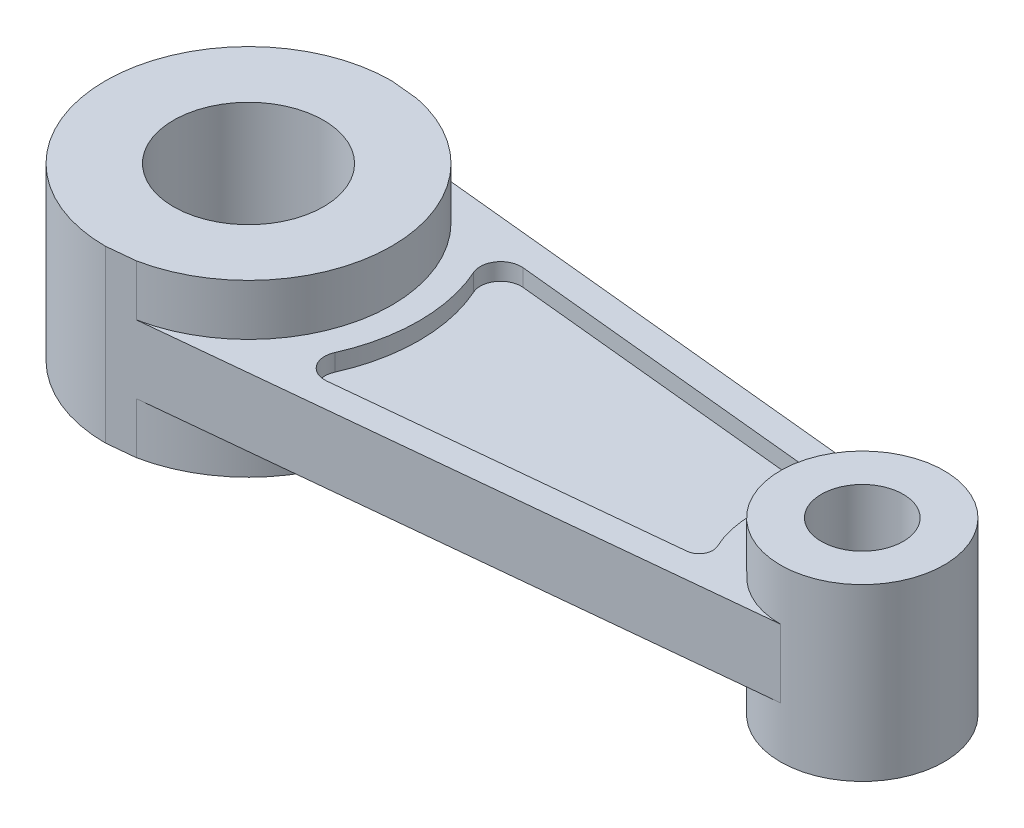
ISO-10303-21;
HEADER;
FILE_DESCRIPTION(('STEP AP214'),'2;1');
FILE_NAME('part.step','',(''),(''),'','','');
FILE_SCHEMA(('AUTOMOTIVE_DESIGN { 1 0 10303 214 1 1 1 1 }'));
ENDSEC;
DATA;
#1=APPLICATION_CONTEXT('core data for automotive mechanical design processes');
#2=APPLICATION_PROTOCOL_DEFINITION('international standard','automotive_design',2000,#1);
#3=PRODUCT_CONTEXT('',#1,'mechanical');
#4=PRODUCT('Part','Part','',(#3));
#5=PRODUCT_RELATED_PRODUCT_CATEGORY('part','',(#4));
#6=PRODUCT_DEFINITION_FORMATION('','',#4);
#7=PRODUCT_DEFINITION_CONTEXT('part definition',#1,'design');
#8=PRODUCT_DEFINITION('design','',#6,#7);
#9=PRODUCT_DEFINITION_SHAPE('','',#8);
#10=(LENGTH_UNIT() NAMED_UNIT(*) SI_UNIT(.MILLI.,.METRE.));
#11=(NAMED_UNIT(*) PLANE_ANGLE_UNIT() SI_UNIT($,.RADIAN.));
#12=(NAMED_UNIT(*) SI_UNIT($,.STERADIAN.) SOLID_ANGLE_UNIT());
#13=UNCERTAINTY_MEASURE_WITH_UNIT(LENGTH_MEASURE(1.E-05),#10,'distance_accuracy_value','');
#14=(GEOMETRIC_REPRESENTATION_CONTEXT(3) GLOBAL_UNCERTAINTY_ASSIGNED_CONTEXT((#13)) GLOBAL_UNIT_ASSIGNED_CONTEXT((#10,
#11,#12)) REPRESENTATION_CONTEXT('',''));
#15=CARTESIAN_POINT('',(0.,0.,0.));
#16=DIRECTION('',(0.,0.,1.));
#17=DIRECTION('',(1.,0.,0.));
#18=AXIS2_PLACEMENT_3D('',#15,#16,#17);
#19=CARTESIAN_POINT('',(1.34984303085783,5.,-13.4984303085783));
#20=DIRECTION('',(0.0995037190209988,0.,-0.995037190209989));
#21=DIRECTION('',(-0.995037190209989,0.,-0.0995037190209988));
#22=AXIS2_PLACEMENT_3D('',#19,#20,#21);
#23=PLANE('',#22);
#24=DIRECTION('',(0.995037190209989,0.,0.0995037190209988));
#25=VECTOR('',#24,1.);
#26=CARTESIAN_POINT('',(-7.59721293666229,2.5,-14.3931359053303));
#27=LINE('',#26,#25);
#28=CARTESIAN_POINT('',(-7.59721293666229,2.5,-14.3931359053303));
#29=VERTEX_POINT('',#28);
#30=CARTESIAN_POINT('',(40.4165773665371,2.5,-9.59175687501041));
#31=VERTEX_POINT('',#30);
#32=EDGE_CURVE('E545',#29,#31,#27,.T.);
#33=ORIENTED_EDGE('',*,*,#32,.T.);
#34=DIRECTION('',(0.,-1.,0.));
#35=VECTOR('',#34,1.);
#36=CARTESIAN_POINT('',(40.4165773665371,5.,-9.59175687501041));
#37=LINE('',#36,#35);
#38=CARTESIAN_POINT('',(40.4165773665371,5.,-9.59175687501041));
#39=VERTEX_POINT('',#38);
#40=EDGE_CURVE('E245',#39,#31,#37,.T.);
#41=ORIENTED_EDGE('',*,*,#40,.F.);
#42=DIRECTION('',(0.995037190209989,0.,0.0995037190209988));
#43=VECTOR('',#42,1.);
#44=CARTESIAN_POINT('',(1.34984303085783,5.,-13.4984303085783));
#45=LINE('',#44,#43);
#46=CARTESIAN_POINT('',(-7.59721293666229,5.,-14.3931359053303));
#47=VERTEX_POINT('',#46);
#48=EDGE_CURVE('E326',#47,#39,#45,.T.);
#49=ORIENTED_EDGE('',*,*,#48,.F.);
#50=DIRECTION('',(0.,-1.,0.));
#51=VECTOR('',#50,1.);
#52=CARTESIAN_POINT('',(-7.59721293666229,5.,-14.3931359053303));
#53=LINE('',#52,#51);
#54=EDGE_CURVE('E382',#47,#29,#53,.T.);
#55=ORIENTED_EDGE('',*,*,#54,.T.);
#56=EDGE_LOOP('',(#33,#41,#49,#55));
#57=FACE_BOUND('',#56,.T.);
#58=ADVANCED_FACE('F39',(#57),#23,.F.);
#59=CARTESIAN_POINT('',(40.2175699284951,5.,-7.60168249459042));
#60=DIRECTION('',(0.,-1.,0.));
#61=DIRECTION('',(0.,0.,-1.));
#62=AXIS2_PLACEMENT_3D('',#59,#60,#61);
#63=CYLINDRICAL_SURFACE('',#62,2.);
#64=CARTESIAN_POINT('',(40.2175699284951,2.5,-7.60168249459042));
#65=DIRECTION('',(0.,-1.,0.));
#66=DIRECTION('',(0.,0.,-1.));
#67=AXIS2_PLACEMENT_3D('',#64,#65,#66);
#68=CIRCLE('',#67,2.);
#69=CARTESIAN_POINT('',(42.0304675587873,2.5,-6.7570511063026));
#70=VERTEX_POINT('',#69);
#71=EDGE_CURVE('E537',#31,#70,#68,.T.);
#72=ORIENTED_EDGE('',*,*,#71,.T.);
#73=DIRECTION('',(0.,-1.,0.));
#74=VECTOR('',#73,1.);
#75=CARTESIAN_POINT('',(42.0304675587873,5.,-6.7570511063026));
#76=LINE('',#75,#74);
#77=CARTESIAN_POINT('',(42.0304675587873,5.,-6.7570511063026));
#78=VERTEX_POINT('',#77);
#79=EDGE_CURVE('E241',#78,#70,#76,.T.);
#80=ORIENTED_EDGE('',*,*,#79,.F.);
#81=CARTESIAN_POINT('',(40.2175699284951,5.,-7.60168249459042));
#82=DIRECTION('',(0.,1.,0.));
#83=DIRECTION('',(0.,0.,1.));
#84=AXIS2_PLACEMENT_3D('',#81,#82,#83);
#85=CIRCLE('',#84,2.);
#86=EDGE_CURVE('E334',#39,#78,#85,.F.);
#87=ORIENTED_EDGE('',*,*,#86,.F.);
#88=ORIENTED_EDGE('',*,*,#40,.T.);
#89=EDGE_LOOP('',(#72,#80,#87,#88));
#90=FACE_BOUND('',#89,.T.);
#91=ADVANCED_FACE('F467',(#90),#63,.F.);
#92=CARTESIAN_POINT('',(56.5336486011247,5.,0.));
#93=DIRECTION('',(0.,-1.,0.));
#94=DIRECTION('',(0.,0.,-1.));
#95=AXIS2_PLACEMENT_3D('',#92,#93,#94);
#96=CYLINDRICAL_SURFACE('',#95,16.);
#97=CARTESIAN_POINT('',(56.5336486011247,2.5,0.));
#98=DIRECTION('',(0.,1.,0.));
#99=DIRECTION('',(0.,0.,1.));
#100=AXIS2_PLACEMENT_3D('',#97,#98,#99);
#101=CIRCLE('',#100,16.);
#102=CARTESIAN_POINT('',(42.0304675587873,2.5,6.75705110630259));
#103=VERTEX_POINT('',#102);
#104=EDGE_CURVE('E532',#70,#103,#101,.T.);
#105=ORIENTED_EDGE('',*,*,#104,.T.);
#106=DIRECTION('',(0.,-1.,0.));
#107=VECTOR('',#106,1.);
#108=CARTESIAN_POINT('',(42.0304675587873,5.,6.7570511063026));
#109=LINE('',#108,#107);
#110=CARTESIAN_POINT('',(42.0304675587873,5.,6.7570511063026));
#111=VERTEX_POINT('',#110);
#112=EDGE_CURVE('E237',#111,#103,#109,.T.);
#113=ORIENTED_EDGE('',*,*,#112,.F.);
#114=CARTESIAN_POINT('',(56.5336486011247,5.,0.));
#115=DIRECTION('',(0.,1.,0.));
#116=DIRECTION('',(0.,0.,1.));
#117=AXIS2_PLACEMENT_3D('',#114,#115,#116);
#118=CIRCLE('',#117,16.);
#119=EDGE_CURVE('E336',#78,#111,#118,.T.);
#120=ORIENTED_EDGE('',*,*,#119,.F.);
#121=ORIENTED_EDGE('',*,*,#79,.T.);
#122=EDGE_LOOP('',(#105,#113,#120,#121));
#123=FACE_BOUND('',#122,.T.);
#124=ADVANCED_FACE('F472',(#123),#96,.T.);
#125=CARTESIAN_POINT('',(40.2175699284951,5.,7.60168249459043));
#126=DIRECTION('',(0.,-1.,0.));
#127=DIRECTION('',(0.,0.,-1.));
#128=AXIS2_PLACEMENT_3D('',#125,#126,#127);
#129=CYLINDRICAL_SURFACE('',#128,2.);
#130=ORIENTED_EDGE('',*,*,#112,.T.);
#131=CARTESIAN_POINT('',(40.2175699284951,2.5,7.60168249459043));
#132=DIRECTION('',(0.,1.,0.));
#133=DIRECTION('',(0.,0.,1.));
#134=AXIS2_PLACEMENT_3D('',#131,#132,#133);
#135=CIRCLE('',#134,2.);
#136=CARTESIAN_POINT('',(40.4165773665371,2.5,9.5917568750104));
#137=VERTEX_POINT('',#136);
#138=EDGE_CURVE('E536',#137,#103,#135,.T.);
#139=ORIENTED_EDGE('',*,*,#138,.F.);
#140=DIRECTION('',(0.,-1.,0.));
#141=VECTOR('',#140,1.);
#142=CARTESIAN_POINT('',(40.4165773665371,5.,9.59175687501041));
#143=LINE('',#142,#141);
#144=CARTESIAN_POINT('',(40.4165773665371,5.,9.59175687501041));
#145=VERTEX_POINT('',#144);
#146=EDGE_CURVE('E233',#145,#137,#143,.T.);
#147=ORIENTED_EDGE('',*,*,#146,.F.);
#148=CARTESIAN_POINT('',(40.2175699284951,5.,7.60168249459043));
#149=DIRECTION('',(0.,1.,0.));
#150=DIRECTION('',(0.,0.,1.));
#151=AXIS2_PLACEMENT_3D('',#148,#149,#150);
#152=CIRCLE('',#151,2.);
#153=EDGE_CURVE('E338',#145,#111,#152,.T.);
#154=ORIENTED_EDGE('',*,*,#153,.T.);
#155=EDGE_LOOP('',(#130,#139,#147,#154));
#156=FACE_BOUND('',#155,.T.);
#157=ADVANCED_FACE('F520',(#156),#129,.F.);
#158=CARTESIAN_POINT('',(1.34984303085783,5.,13.4984303085783));
#159=DIRECTION('',(-0.0995037190209988,0.,-0.995037190209989));
#160=DIRECTION('',(-0.995037190209989,0.,0.0995037190209988));
#161=AXIS2_PLACEMENT_3D('',#158,#159,#160);
#162=PLANE('',#161);
#163=ORIENTED_EDGE('',*,*,#146,.T.);
#164=DIRECTION('',(0.995037190209989,0.,-0.0995037190209988));
#165=VECTOR('',#164,1.);
#166=CARTESIAN_POINT('',(-7.59721293666228,2.5,14.3931359053303));
#167=LINE('',#166,#165);
#168=CARTESIAN_POINT('',(-7.59721293666228,2.5,14.3931359053303));
#169=VERTEX_POINT('',#168);
#170=EDGE_CURVE('E445',#169,#137,#167,.T.);
#171=ORIENTED_EDGE('',*,*,#170,.F.);
#172=DIRECTION('',(0.,-1.,0.));
#173=VECTOR('',#172,1.);
#174=CARTESIAN_POINT('',(-7.59721293666228,5.,14.3931359053303));
#175=LINE('',#174,#173);
#176=CARTESIAN_POINT('',(-7.59721293666228,5.,14.3931359053303));
#177=VERTEX_POINT('',#176);
#178=EDGE_CURVE('E219',#177,#169,#175,.T.);
#179=ORIENTED_EDGE('',*,*,#178,.F.);
#180=DIRECTION('',(0.995037190209989,0.,-0.0995037190209988));
#181=VECTOR('',#180,1.);
#182=CARTESIAN_POINT('',(1.34984303085783,5.,13.4984303085783));
#183=LINE('',#182,#181);
#184=EDGE_CURVE('E341',#177,#145,#183,.T.);
#185=ORIENTED_EDGE('',*,*,#184,.T.);
#186=EDGE_LOOP('',(#163,#171,#179,#185));
#187=FACE_BOUND('',#186,.T.);
#188=ADVANCED_FACE('F517',(#187),#162,.T.);
#189=CARTESIAN_POINT('',(-7.89572409372528,5.,11.4080243347004));
#190=DIRECTION('',(0.,-1.,0.));
#191=DIRECTION('',(0.,0.,-1.));
#192=AXIS2_PLACEMENT_3D('',#189,#190,#191);
#193=CYLINDRICAL_SURFACE('',#192,3.);
#194=CARTESIAN_POINT('',(-7.89572409372528,2.5,11.4080243347004));
#195=DIRECTION('',(0.,-1.,0.));
#196=DIRECTION('',(0.,0.,-1.));
#197=AXIS2_PLACEMENT_3D('',#194,#195,#196);
#198=CIRCLE('',#197,3.);
#199=CARTESIAN_POINT('',(-10.6354341621342,2.5,10.1857360131253));
#200=VERTEX_POINT('',#199);
#201=EDGE_CURVE('E203',#169,#200,#198,.T.);
#202=ORIENTED_EDGE('',*,*,#201,.T.);
#203=DIRECTION('',(0.,-1.,0.));
#204=VECTOR('',#203,1.);
#205=CARTESIAN_POINT('',(-10.6354341621342,5.,10.1857360131253));
#206=LINE('',#205,#204);
#207=CARTESIAN_POINT('',(-10.6354341621342,5.,10.1857360131253));
#208=VERTEX_POINT('',#207);
#209=EDGE_CURVE('E217',#208,#200,#206,.T.);
#210=ORIENTED_EDGE('',*,*,#209,.F.);
#211=CARTESIAN_POINT('',(-7.89572409372528,5.,11.4080243347004));
#212=DIRECTION('',(0.,1.,0.));
#213=DIRECTION('',(0.,0.,1.));
#214=AXIS2_PLACEMENT_3D('',#211,#212,#213);
#215=CIRCLE('',#214,3.);
#216=EDGE_CURVE('E344',#177,#208,#215,.F.);
#217=ORIENTED_EDGE('',*,*,#216,.F.);
#218=ORIENTED_EDGE('',*,*,#178,.T.);
#219=EDGE_LOOP('',(#202,#210,#217,#218));
#220=FACE_BOUND('',#219,.T.);
#221=ADVANCED_FACE('F215',(#220),#193,.F.);
#222=CARTESIAN_POINT('',(-33.4663513988753,5.,0.));
#223=DIRECTION('',(0.,-1.,0.));
#224=DIRECTION('',(0.,0.,-1.));
#225=AXIS2_PLACEMENT_3D('',#222,#223,#224);
#226=CYLINDRICAL_SURFACE('',#225,25.);
#227=CARTESIAN_POINT('',(-33.4663513988753,2.5,0.));
#228=DIRECTION('',(0.,1.,0.));
#229=DIRECTION('',(0.,0.,1.));
#230=AXIS2_PLACEMENT_3D('',#227,#228,#229);
#231=CIRCLE('',#230,25.);
#232=CARTESIAN_POINT('',(-10.6354341621342,2.5,-10.1857360131253));
#233=VERTEX_POINT('',#232);
#234=EDGE_CURVE('E200',#200,#233,#231,.T.);
#235=ORIENTED_EDGE('',*,*,#234,.T.);
#236=DIRECTION('',(0.,-1.,0.));
#237=VECTOR('',#236,1.);
#238=CARTESIAN_POINT('',(-10.6354341621342,5.,-10.1857360131253));
#239=LINE('',#238,#237);
#240=CARTESIAN_POINT('',(-10.6354341621342,5.,-10.1857360131253));
#241=VERTEX_POINT('',#240);
#242=EDGE_CURVE('E228',#241,#233,#239,.T.);
#243=ORIENTED_EDGE('',*,*,#242,.F.);
#244=CARTESIAN_POINT('',(-33.4663513988753,5.,0.));
#245=DIRECTION('',(0.,1.,0.));
#246=DIRECTION('',(0.,0.,1.));
#247=AXIS2_PLACEMENT_3D('',#244,#245,#246);
#248=CIRCLE('',#247,25.);
#249=EDGE_CURVE('E223',#208,#241,#248,.T.);
#250=ORIENTED_EDGE('',*,*,#249,.F.);
#251=ORIENTED_EDGE('',*,*,#209,.T.);
#252=EDGE_LOOP('',(#235,#243,#250,#251));
#253=FACE_BOUND('',#252,.T.);
#254=ADVANCED_FACE('F222',(#253),#226,.T.);
#255=CARTESIAN_POINT('',(-7.89572409372528,5.,-11.4080243347004));
#256=DIRECTION('',(0.,-1.,0.));
#257=DIRECTION('',(0.,0.,-1.));
#258=AXIS2_PLACEMENT_3D('',#255,#256,#257);
#259=CYLINDRICAL_SURFACE('',#258,3.);
#260=ORIENTED_EDGE('',*,*,#242,.T.);
#261=CARTESIAN_POINT('',(-7.89572409372528,2.5,-11.4080243347004));
#262=DIRECTION('',(0.,1.,0.));
#263=DIRECTION('',(0.,0.,1.));
#264=AXIS2_PLACEMENT_3D('',#261,#262,#263);
#265=CIRCLE('',#264,3.);
#266=EDGE_CURVE('E206',#29,#233,#265,.T.);
#267=ORIENTED_EDGE('',*,*,#266,.F.);
#268=ORIENTED_EDGE('',*,*,#54,.F.);
#269=CARTESIAN_POINT('',(-7.89572409372528,5.,-11.4080243347004));
#270=DIRECTION('',(0.,1.,0.));
#271=DIRECTION('',(0.,0.,1.));
#272=AXIS2_PLACEMENT_3D('',#269,#270,#271);
#273=CIRCLE('',#272,3.);
#274=EDGE_CURVE('E252',#47,#241,#273,.T.);
#275=ORIENTED_EDGE('',*,*,#274,.T.);
#276=EDGE_LOOP('',(#260,#267,#268,#275));
#277=FACE_BOUND('',#276,.T.);
#278=ADVANCED_FACE('F496',(#277),#259,.F.);
#279=CARTESIAN_POINT('',(-33.4663513988753,12.5,0.));
#280=DIRECTION('',(0.,-1.,0.));
#281=DIRECTION('',(0.,0.,-1.));
#282=AXIS2_PLACEMENT_3D('',#279,#280,#281);
#283=CYLINDRICAL_SURFACE('',#282,21.);
#284=CARTESIAN_POINT('',(-33.4663513988753,-5.,0.));
#285=DIRECTION('',(0.,1.,0.));
#286=DIRECTION('',(0.,0.,1.));
#287=AXIS2_PLACEMENT_3D('',#284,#285,#286);
#288=CIRCLE('',#287,21.);
#289=CARTESIAN_POINT('',(-29.3079355572912,-5.,20.5841584158416));
#290=VERTEX_POINT('',#289);
#291=CARTESIAN_POINT('',(-29.3079355572912,-5.,-20.5841584158416));
#292=VERTEX_POINT('',#291);
#293=EDGE_CURVE('E354',#290,#292,#288,.T.);
#294=ORIENTED_EDGE('',*,*,#293,.F.);
#295=DIRECTION('',(0.,-1.,0.));
#296=VECTOR('',#295,1.);
#297=CARTESIAN_POINT('',(-29.3079355572912,12.5,20.5841584158416));
#298=LINE('',#297,#296);
#299=CARTESIAN_POINT('',(-29.3079355572912,-12.5,20.5841584158416));
#300=VERTEX_POINT('',#299);
#301=EDGE_CURVE('E47',#290,#300,#298,.T.);
#302=ORIENTED_EDGE('',*,*,#301,.T.);
#303=CARTESIAN_POINT('',(-33.4663513988753,-12.5,0.));
#304=DIRECTION('',(0.,1.,0.));
#305=DIRECTION('',(0.,0.,1.));
#306=AXIS2_PLACEMENT_3D('',#303,#304,#305);
#307=CIRCLE('',#306,21.);
#308=CARTESIAN_POINT('',(-29.3079355572912,-12.5,-20.5841584158416));
#309=VERTEX_POINT('',#308);
#310=EDGE_CURVE('E274',#300,#309,#307,.T.);
#311=ORIENTED_EDGE('',*,*,#310,.T.);
#312=DIRECTION('',(0.,-1.,0.));
#313=VECTOR('',#312,1.);
#314=CARTESIAN_POINT('',(-29.3079355572912,12.5,-20.5841584158416));
#315=LINE('',#314,#313);
#316=EDGE_CURVE('E284',#292,#309,#315,.T.);
#317=ORIENTED_EDGE('',*,*,#316,.F.);
#318=EDGE_LOOP('',(#294,#302,#311,#317));
#319=FACE_BOUND('',#318,.T.);
#320=ADVANCED_FACE('F299',(#319),#283,.T.);
#321=CARTESIAN_POINT('',(1.74785790694183,12.5,17.4785790694183));
#322=DIRECTION('',(-0.0995037190209989,0.,-0.995037190209989));
#323=DIRECTION('',(-0.995037190209989,0.,0.0995037190209989));
#324=AXIS2_PLACEMENT_3D('',#321,#322,#323);
#325=PLANE('',#324);
#326=DIRECTION('',(0.995037190209989,0.,-0.0995037190209989));
#327=VECTOR('',#326,1.);
#328=CARTESIAN_POINT('',(1.74785790694183,-12.5,17.4785790694183));
#329=LINE('',#328,#327);
#330=CARTESIAN_POINT('',(-33.4663513988753,-12.5,21.));
#331=VERTEX_POINT('',#330);
#332=EDGE_CURVE('E271',#331,#300,#329,.T.);
#333=ORIENTED_EDGE('',*,*,#332,.T.);
#334=ORIENTED_EDGE('',*,*,#301,.F.);
#335=DIRECTION('',(0.995037190209989,0.,-0.0995037190209989));
#336=VECTOR('',#335,1.);
#337=CARTESIAN_POINT('',(1.74785790694183,-5.,17.4785790694183));
#338=LINE('',#337,#336);
#339=CARTESIAN_POINT('',(56.5336486011247,-5.,12.));
#340=VERTEX_POINT('',#339);
#341=EDGE_CURVE('E356',#290,#340,#338,.T.);
#342=ORIENTED_EDGE('',*,*,#341,.T.);
#343=DIRECTION('',(0.,-1.,0.));
#344=VECTOR('',#343,1.);
#345=CARTESIAN_POINT('',(56.5336486011247,5.,12.));
#346=LINE('',#345,#344);
#347=CARTESIAN_POINT('',(56.5336486011248,5.,12.));
#348=VERTEX_POINT('',#347);
#349=EDGE_CURVE('E249',#348,#340,#346,.T.);
#350=ORIENTED_EDGE('',*,*,#349,.F.);
#351=DIRECTION('',(0.995037190209989,0.,-0.0995037190209989));
#352=VECTOR('',#351,1.);
#353=CARTESIAN_POINT('',(1.74785790694183,5.,17.4785790694183));
#354=LINE('',#353,#352);
#355=CARTESIAN_POINT('',(-29.3079355572912,5.,20.5841584158416));
#356=VERTEX_POINT('',#355);
#357=EDGE_CURVE('E323',#356,#348,#354,.T.);
#358=ORIENTED_EDGE('',*,*,#357,.F.);
#359=CARTESIAN_POINT('',(-29.3079355572912,12.5,20.5841584158416));
#360=VERTEX_POINT('',#359);
#361=EDGE_CURVE('E11',#360,#356,#298,.T.);
#362=ORIENTED_EDGE('',*,*,#361,.F.);
#363=DIRECTION('',(0.995037190209989,0.,-0.0995037190209989));
#364=VECTOR('',#363,1.);
#365=CARTESIAN_POINT('',(1.74785790694183,12.5,17.4785790694183));
#366=LINE('',#365,#364);
#367=CARTESIAN_POINT('',(-33.4663513988753,12.5,21.));
#368=VERTEX_POINT('',#367);
#369=EDGE_CURVE('E259',#368,#360,#366,.T.);
#370=ORIENTED_EDGE('',*,*,#369,.F.);
#371=DIRECTION('',(0.,-1.,0.));
#372=VECTOR('',#371,1.);
#373=CARTESIAN_POINT('',(-33.4663513988753,12.5,21.));
#374=LINE('',#373,#372);
#375=EDGE_CURVE('E280',#368,#331,#374,.T.);
#376=ORIENTED_EDGE('',*,*,#375,.T.);
#377=EDGE_LOOP('',(#333,#334,#342,#350,#358,#362,#370,#376));
#378=FACE_BOUND('',#377,.T.);
#379=ADVANCED_FACE('F311',(#378),#325,.F.);
#380=ORIENTED_EDGE('',*,*,#361,.T.);
#381=CARTESIAN_POINT('',(-33.4663513988753,5.,0.));
#382=DIRECTION('',(0.,1.,0.));
#383=DIRECTION('',(0.,0.,1.));
#384=AXIS2_PLACEMENT_3D('',#381,#382,#383);
#385=CIRCLE('',#384,21.);
#386=CARTESIAN_POINT('',(-29.3079355572912,5.,-20.5841584158416));
#387=VERTEX_POINT('',#386);
#388=EDGE_CURVE('E320',#356,#387,#385,.T.);
#389=ORIENTED_EDGE('',*,*,#388,.T.);
#390=CARTESIAN_POINT('',(-29.3079355572912,12.5,-20.5841584158416));
#391=VERTEX_POINT('',#390);
#392=EDGE_CURVE('E285',#391,#387,#315,.T.);
#393=ORIENTED_EDGE('',*,*,#392,.F.);
#394=CARTESIAN_POINT('',(-33.4663513988753,12.5,0.));
#395=DIRECTION('',(0.,1.,0.));
#396=DIRECTION('',(0.,0.,1.));
#397=AXIS2_PLACEMENT_3D('',#394,#395,#396);
#398=CIRCLE('',#397,21.);
#399=EDGE_CURVE('E263',#360,#391,#398,.T.);
#400=ORIENTED_EDGE('',*,*,#399,.F.);
#401=EDGE_LOOP('',(#380,#389,#393,#400));
#402=FACE_BOUND('',#401,.T.);
#403=ADVANCED_FACE('F318',(#402),#283,.T.);
#404=CARTESIAN_POINT('',(1.74785790694183,12.5,-17.4785790694183));
#405=DIRECTION('',(0.0995037190209989,0.,-0.995037190209989));
#406=DIRECTION('',(-0.995037190209989,0.,-0.0995037190209989));
#407=AXIS2_PLACEMENT_3D('',#404,#405,#406);
#408=PLANE('',#407);
#409=DIRECTION('',(0.995037190209989,0.,0.0995037190209989));
#410=VECTOR('',#409,1.);
#411=CARTESIAN_POINT('',(1.74785790694183,-12.5,-17.4785790694183));
#412=LINE('',#411,#410);
#413=CARTESIAN_POINT('',(-33.4663513988753,-12.5,-21.));
#414=VERTEX_POINT('',#413);
#415=EDGE_CURVE('E277',#414,#309,#412,.T.);
#416=ORIENTED_EDGE('',*,*,#415,.F.);
#417=DIRECTION('',(0.,-1.,0.));
#418=VECTOR('',#417,1.);
#419=CARTESIAN_POINT('',(-33.4663513988753,12.5,-21.));
#420=LINE('',#419,#418);
#421=CARTESIAN_POINT('',(-33.4663513988753,12.5,-21.));
#422=VERTEX_POINT('',#421);
#423=EDGE_CURVE('E283',#422,#414,#420,.T.);
#424=ORIENTED_EDGE('',*,*,#423,.F.);
#425=DIRECTION('',(0.995037190209989,0.,0.0995037190209989));
#426=VECTOR('',#425,1.);
#427=CARTESIAN_POINT('',(1.74785790694183,12.5,-17.4785790694183));
#428=LINE('',#427,#426);
#429=EDGE_CURVE('E265',#422,#391,#428,.T.);
#430=ORIENTED_EDGE('',*,*,#429,.T.);
#431=ORIENTED_EDGE('',*,*,#392,.T.);
#432=DIRECTION('',(0.995037190209989,0.,0.0995037190209989));
#433=VECTOR('',#432,1.);
#434=CARTESIAN_POINT('',(1.74785790694183,5.,-17.4785790694183));
#435=LINE('',#434,#433);
#436=CARTESIAN_POINT('',(56.5336486011248,5.,-12.));
#437=VERTEX_POINT('',#436);
#438=EDGE_CURVE('E324',#387,#437,#435,.T.);
#439=ORIENTED_EDGE('',*,*,#438,.T.);
#440=DIRECTION('',(0.,-1.,0.));
#441=VECTOR('',#440,1.);
#442=CARTESIAN_POINT('',(56.5336486011247,5.,-12.));
#443=LINE('',#442,#441);
#444=CARTESIAN_POINT('',(56.5336486011247,-5.,-12.));
#445=VERTEX_POINT('',#444);
#446=EDGE_CURVE('E251',#437,#445,#443,.T.);
#447=ORIENTED_EDGE('',*,*,#446,.T.);
#448=DIRECTION('',(0.995037190209989,0.,0.0995037190209989));
#449=VECTOR('',#448,1.);
#450=CARTESIAN_POINT('',(1.74785790694183,-5.,-17.4785790694183));
#451=LINE('',#450,#449);
#452=EDGE_CURVE('E295',#292,#445,#451,.T.);
#453=ORIENTED_EDGE('',*,*,#452,.F.);
#454=ORIENTED_EDGE('',*,*,#316,.T.);
#455=EDGE_LOOP('',(#416,#424,#430,#431,#439,#447,#453,#454));
#456=FACE_BOUND('',#455,.T.);
#457=ADVANCED_FACE('F293',(#456),#408,.T.);
#458=CARTESIAN_POINT('',(-33.4663513988753,12.5,0.));
#459=DIRECTION('',(0.,-1.,0.));
#460=DIRECTION('',(0.,0.,-1.));
#461=AXIS2_PLACEMENT_3D('',#458,#459,#460);
#462=CYLINDRICAL_SURFACE('',#461,11.);
#463=CARTESIAN_POINT('',(-33.4663513988753,12.5,0.));
#464=DIRECTION('',(0.,1.,0.));
#465=DIRECTION('',(0.,0.,1.));
#466=AXIS2_PLACEMENT_3D('',#463,#464,#465);
#467=CIRCLE('',#466,11.);
#468=CARTESIAN_POINT('',(-33.4663513988753,12.5,11.));
#469=VERTEX_POINT('',#468);
#470=EDGE_CURVE('E256',#469,#469,#467,.T.);
#471=ORIENTED_EDGE('',*,*,#470,.T.);
#472=EDGE_LOOP('',(#471));
#473=FACE_BOUND('',#472,.T.);
#474=CARTESIAN_POINT('',(-33.4663513988753,-12.5,0.));
#475=DIRECTION('',(0.,1.,0.));
#476=DIRECTION('',(0.,0.,1.));
#477=AXIS2_PLACEMENT_3D('',#474,#475,#476);
#478=CIRCLE('',#477,11.);
#479=CARTESIAN_POINT('',(-33.4663513988753,-12.5,11.));
#480=VERTEX_POINT('',#479);
#481=EDGE_CURVE('E248',#480,#480,#478,.T.);
#482=ORIENTED_EDGE('',*,*,#481,.F.);
#483=EDGE_LOOP('',(#482));
#484=FACE_BOUND('',#483,.T.);
#485=ADVANCED_FACE('F41',(#473,#484),#462,.F.);
#486=EDGE_CURVE('E260',#414,#331,#307,.T.);
#487=ORIENTED_EDGE('',*,*,#486,.T.);
#488=ORIENTED_EDGE('',*,*,#375,.F.);
#489=EDGE_CURVE('E266',#422,#368,#398,.T.);
#490=ORIENTED_EDGE('',*,*,#489,.F.);
#491=ORIENTED_EDGE('',*,*,#423,.T.);
#492=EDGE_LOOP('',(#487,#488,#490,#491));
#493=FACE_BOUND('',#492,.T.);
#494=ADVANCED_FACE('F307',(#493),#283,.T.);
#495=CARTESIAN_POINT('',(0.,12.5,0.));
#496=DIRECTION('',(0.,1.,0.));
#497=DIRECTION('',(0.,0.,1.));
#498=AXIS2_PLACEMENT_3D('',#495,#496,#497);
#499=PLANE('',#498);
#500=ORIENTED_EDGE('',*,*,#470,.F.);
#501=EDGE_LOOP('',(#500));
#502=FACE_BOUND('',#501,.T.);
#503=ORIENTED_EDGE('',*,*,#369,.T.);
#504=ORIENTED_EDGE('',*,*,#399,.T.);
#505=ORIENTED_EDGE('',*,*,#429,.F.);
#506=ORIENTED_EDGE('',*,*,#489,.T.);
#507=EDGE_LOOP('',(#503,#504,#505,#506));
#508=FACE_BOUND('',#507,.T.);
#509=ADVANCED_FACE('F314',(#502,#508),#499,.T.);
#510=CARTESIAN_POINT('',(0.,-12.5,0.));
#511=DIRECTION('',(0.,1.,0.));
#512=DIRECTION('',(0.,0.,1.));
#513=AXIS2_PLACEMENT_3D('',#510,#511,#512);
#514=PLANE('',#513);
#515=ORIENTED_EDGE('',*,*,#481,.T.);
#516=EDGE_LOOP('',(#515));
#517=FACE_BOUND('',#516,.T.);
#518=ORIENTED_EDGE('',*,*,#332,.F.);
#519=ORIENTED_EDGE('',*,*,#486,.F.);
#520=ORIENTED_EDGE('',*,*,#415,.T.);
#521=ORIENTED_EDGE('',*,*,#310,.F.);
#522=EDGE_LOOP('',(#518,#519,#520,#521));
#523=FACE_BOUND('',#522,.T.);
#524=ADVANCED_FACE('F304',(#517,#523),#514,.F.);
#525=CARTESIAN_POINT('',(40.4165773665371,-2.5,-9.59175687501041));
#526=VERTEX_POINT('',#525);
#527=CARTESIAN_POINT('',(40.4165773665371,-5.,-9.59175687501041));
#528=VERTEX_POINT('',#527);
#529=EDGE_CURVE('E244',#526,#528,#37,.T.);
#530=ORIENTED_EDGE('',*,*,#529,.F.);
#531=DIRECTION('',(0.995037190209989,0.,0.0995037190209988));
#532=VECTOR('',#531,1.);
#533=CARTESIAN_POINT('',(-7.59721293666229,-2.5,-14.3931359053303));
#534=LINE('',#533,#532);
#535=CARTESIAN_POINT('',(-7.59721293666229,-2.5,-14.3931359053303));
#536=VERTEX_POINT('',#535);
#537=EDGE_CURVE('E393',#536,#526,#534,.T.);
#538=ORIENTED_EDGE('',*,*,#537,.F.);
#539=CARTESIAN_POINT('',(-7.59721293666229,-5.,-14.3931359053303));
#540=VERTEX_POINT('',#539);
#541=EDGE_CURVE('E255',#536,#540,#53,.T.);
#542=ORIENTED_EDGE('',*,*,#541,.T.);
#543=DIRECTION('',(0.995037190209989,0.,0.0995037190209988));
#544=VECTOR('',#543,1.);
#545=CARTESIAN_POINT('',(1.34984303085783,-5.,-13.4984303085783));
#546=LINE('',#545,#544);
#547=EDGE_CURVE('E359',#540,#528,#546,.T.);
#548=ORIENTED_EDGE('',*,*,#547,.T.);
#549=EDGE_LOOP('',(#530,#538,#542,#548));
#550=FACE_BOUND('',#549,.T.);
#551=ADVANCED_FACE('F391',(#550),#23,.F.);
#552=CARTESIAN_POINT('',(42.0304675587873,-2.5,-6.7570511063026));
#553=VERTEX_POINT('',#552);
#554=CARTESIAN_POINT('',(42.0304675587873,-5.,-6.7570511063026));
#555=VERTEX_POINT('',#554);
#556=EDGE_CURVE('E240',#553,#555,#76,.T.);
#557=ORIENTED_EDGE('',*,*,#556,.F.);
#558=CARTESIAN_POINT('',(40.2175699284951,-2.5,-7.60168249459042));
#559=DIRECTION('',(0.,-1.,0.));
#560=DIRECTION('',(0.,0.,-1.));
#561=AXIS2_PLACEMENT_3D('',#558,#559,#560);
#562=CIRCLE('',#561,2.);
#563=EDGE_CURVE('E54',#526,#553,#562,.T.);
#564=ORIENTED_EDGE('',*,*,#563,.F.);
#565=ORIENTED_EDGE('',*,*,#529,.T.);
#566=CARTESIAN_POINT('',(40.2175699284951,-5.,-7.60168249459042));
#567=DIRECTION('',(0.,1.,0.));
#568=DIRECTION('',(0.,0.,1.));
#569=AXIS2_PLACEMENT_3D('',#566,#567,#568);
#570=CIRCLE('',#569,2.);
#571=EDGE_CURVE('E362',#528,#555,#570,.F.);
#572=ORIENTED_EDGE('',*,*,#571,.T.);
#573=EDGE_LOOP('',(#557,#564,#565,#572));
#574=FACE_BOUND('',#573,.T.);
#575=ADVANCED_FACE('F422',(#574),#63,.F.);
#576=CARTESIAN_POINT('',(42.0304675587873,-2.5,6.7570511063026));
#577=VERTEX_POINT('',#576);
#578=CARTESIAN_POINT('',(42.0304675587873,-5.,6.7570511063026));
#579=VERTEX_POINT('',#578);
#580=EDGE_CURVE('E236',#577,#579,#109,.T.);
#581=ORIENTED_EDGE('',*,*,#580,.F.);
#582=CARTESIAN_POINT('',(56.5336486011247,-2.5,0.));
#583=DIRECTION('',(0.,1.,0.));
#584=DIRECTION('',(0.,0.,1.));
#585=AXIS2_PLACEMENT_3D('',#582,#583,#584);
#586=CIRCLE('',#585,16.);
#587=EDGE_CURVE('E62',#553,#577,#586,.T.);
#588=ORIENTED_EDGE('',*,*,#587,.F.);
#589=ORIENTED_EDGE('',*,*,#556,.T.);
#590=CARTESIAN_POINT('',(56.5336486011247,-5.,0.));
#591=DIRECTION('',(0.,1.,0.));
#592=DIRECTION('',(0.,0.,1.));
#593=AXIS2_PLACEMENT_3D('',#590,#591,#592);
#594=CIRCLE('',#593,16.);
#595=EDGE_CURVE('E365',#555,#579,#594,.T.);
#596=ORIENTED_EDGE('',*,*,#595,.T.);
#597=EDGE_LOOP('',(#581,#588,#589,#596));
#598=FACE_BOUND('',#597,.T.);
#599=ADVANCED_FACE('F421',(#598),#96,.T.);
#600=CARTESIAN_POINT('',(40.2175699284951,-2.5,7.60168249459043));
#601=DIRECTION('',(0.,1.,0.));
#602=DIRECTION('',(0.,0.,1.));
#603=AXIS2_PLACEMENT_3D('',#600,#601,#602);
#604=CIRCLE('',#603,2.);
#605=CARTESIAN_POINT('',(40.4165773665371,-2.5,9.59175687501041));
#606=VERTEX_POINT('',#605);
#607=EDGE_CURVE('E433',#606,#577,#604,.T.);
#608=ORIENTED_EDGE('',*,*,#607,.T.);
#609=ORIENTED_EDGE('',*,*,#580,.T.);
#610=CARTESIAN_POINT('',(40.2175699284951,-5.,7.60168249459043));
#611=DIRECTION('',(0.,1.,0.));
#612=DIRECTION('',(0.,0.,1.));
#613=AXIS2_PLACEMENT_3D('',#610,#611,#612);
#614=CIRCLE('',#613,2.);
#615=CARTESIAN_POINT('',(40.4165773665371,-5.,9.59175687501041));
#616=VERTEX_POINT('',#615);
#617=EDGE_CURVE('E368',#616,#579,#614,.T.);
#618=ORIENTED_EDGE('',*,*,#617,.F.);
#619=EDGE_CURVE('E232',#606,#616,#143,.T.);
#620=ORIENTED_EDGE('',*,*,#619,.F.);
#621=EDGE_LOOP('',(#608,#609,#618,#620));
#622=FACE_BOUND('',#621,.T.);
#623=ADVANCED_FACE('F420',(#622),#129,.F.);
#624=DIRECTION('',(0.995037190209989,0.,-0.0995037190209988));
#625=VECTOR('',#624,1.);
#626=CARTESIAN_POINT('',(-7.59721293666228,-2.5,14.3931359053303));
#627=LINE('',#626,#625);
#628=CARTESIAN_POINT('',(-7.59721293666228,-2.5,14.3931359053303));
#629=VERTEX_POINT('',#628);
#630=EDGE_CURVE('E220',#629,#606,#627,.T.);
#631=ORIENTED_EDGE('',*,*,#630,.T.);
#632=ORIENTED_EDGE('',*,*,#619,.T.);
#633=DIRECTION('',(0.995037190209989,0.,-0.0995037190209988));
#634=VECTOR('',#633,1.);
#635=CARTESIAN_POINT('',(1.34984303085783,-5.,13.4984303085783));
#636=LINE('',#635,#634);
#637=CARTESIAN_POINT('',(-7.59721293666228,-5.,14.3931359053303));
#638=VERTEX_POINT('',#637);
#639=EDGE_CURVE('E371',#638,#616,#636,.T.);
#640=ORIENTED_EDGE('',*,*,#639,.F.);
#641=EDGE_CURVE('E224',#629,#638,#175,.T.);
#642=ORIENTED_EDGE('',*,*,#641,.F.);
#643=EDGE_LOOP('',(#631,#632,#640,#642));
#644=FACE_BOUND('',#643,.T.);
#645=ADVANCED_FACE('F414',(#644),#162,.T.);
#646=CARTESIAN_POINT('',(-10.6354341621342,-2.5,10.1857360131253));
#647=VERTEX_POINT('',#646);
#648=CARTESIAN_POINT('',(-10.6354341621342,-5.,10.1857360131253));
#649=VERTEX_POINT('',#648);
#650=EDGE_CURVE('E225',#647,#649,#206,.T.);
#651=ORIENTED_EDGE('',*,*,#650,.F.);
#652=CARTESIAN_POINT('',(-7.89572409372528,-2.5,11.4080243347004));
#653=DIRECTION('',(0.,-1.,0.));
#654=DIRECTION('',(0.,0.,-1.));
#655=AXIS2_PLACEMENT_3D('',#652,#653,#654);
#656=CIRCLE('',#655,3.);
#657=EDGE_CURVE('E552',#629,#647,#656,.T.);
#658=ORIENTED_EDGE('',*,*,#657,.F.);
#659=ORIENTED_EDGE('',*,*,#641,.T.);
#660=CARTESIAN_POINT('',(-7.89572409372528,-5.,11.4080243347004));
#661=DIRECTION('',(0.,1.,0.));
#662=DIRECTION('',(0.,0.,1.));
#663=AXIS2_PLACEMENT_3D('',#660,#661,#662);
#664=CIRCLE('',#663,3.);
#665=EDGE_CURVE('E374',#638,#649,#664,.F.);
#666=ORIENTED_EDGE('',*,*,#665,.T.);
#667=EDGE_LOOP('',(#651,#658,#659,#666));
#668=FACE_BOUND('',#667,.T.);
#669=ADVANCED_FACE('F509',(#668),#193,.F.);
#670=CARTESIAN_POINT('',(-10.6354341621342,-2.5,-10.1857360131253));
#671=VERTEX_POINT('',#670);
#672=CARTESIAN_POINT('',(-10.6354341621342,-5.,-10.1857360131253));
#673=VERTEX_POINT('',#672);
#674=EDGE_CURVE('E384',#671,#673,#239,.T.);
#675=ORIENTED_EDGE('',*,*,#674,.F.);
#676=CARTESIAN_POINT('',(-33.4663513988753,-2.5,0.));
#677=DIRECTION('',(0.,1.,0.));
#678=DIRECTION('',(0.,0.,1.));
#679=AXIS2_PLACEMENT_3D('',#676,#677,#678);
#680=CIRCLE('',#679,25.);
#681=EDGE_CURVE('E428',#647,#671,#680,.T.);
#682=ORIENTED_EDGE('',*,*,#681,.F.);
#683=ORIENTED_EDGE('',*,*,#650,.T.);
#684=CARTESIAN_POINT('',(-33.4663513988753,-5.,0.));
#685=DIRECTION('',(0.,1.,0.));
#686=DIRECTION('',(0.,0.,1.));
#687=AXIS2_PLACEMENT_3D('',#684,#685,#686);
#688=CIRCLE('',#687,25.);
#689=EDGE_CURVE('E377',#649,#673,#688,.T.);
#690=ORIENTED_EDGE('',*,*,#689,.T.);
#691=EDGE_LOOP('',(#675,#682,#683,#690));
#692=FACE_BOUND('',#691,.T.);
#693=ADVANCED_FACE('F407',(#692),#226,.T.);
#694=CARTESIAN_POINT('',(-7.89572409372528,-2.5,-11.4080243347004));
#695=DIRECTION('',(0.,1.,0.));
#696=DIRECTION('',(0.,0.,1.));
#697=AXIS2_PLACEMENT_3D('',#694,#695,#696);
#698=CIRCLE('',#697,3.);
#699=EDGE_CURVE('E404',#536,#671,#698,.T.);
#700=ORIENTED_EDGE('',*,*,#699,.T.);
#701=ORIENTED_EDGE('',*,*,#674,.T.);
#702=CARTESIAN_POINT('',(-7.89572409372528,-5.,-11.4080243347004));
#703=DIRECTION('',(0.,1.,0.));
#704=DIRECTION('',(0.,0.,1.));
#705=AXIS2_PLACEMENT_3D('',#702,#703,#704);
#706=CIRCLE('',#705,3.);
#707=EDGE_CURVE('E380',#540,#673,#706,.T.);
#708=ORIENTED_EDGE('',*,*,#707,.F.);
#709=ORIENTED_EDGE('',*,*,#541,.F.);
#710=EDGE_LOOP('',(#700,#701,#708,#709));
#711=FACE_BOUND('',#710,.T.);
#712=ADVANCED_FACE('F402',(#711),#259,.F.);
#713=CARTESIAN_POINT('',(0.,5.,0.));
#714=DIRECTION('',(0.,1.,0.));
#715=DIRECTION('',(0.,0.,1.));
#716=AXIS2_PLACEMENT_3D('',#713,#714,#715);
#717=PLANE('',#716);
#718=CARTESIAN_POINT('',(56.5336486011247,5.,0.));
#719=DIRECTION('',(0.,1.,0.));
#720=DIRECTION('',(0.,0.,1.));
#721=AXIS2_PLACEMENT_3D('',#718,#719,#720);
#722=CIRCLE('',#721,12.);
#723=EDGE_CURVE('E328',#437,#348,#722,.T.);
#724=ORIENTED_EDGE('',*,*,#723,.F.);
#725=ORIENTED_EDGE('',*,*,#438,.F.);
#726=ORIENTED_EDGE('',*,*,#388,.F.);
#727=ORIENTED_EDGE('',*,*,#357,.T.);
#728=EDGE_LOOP('',(#724,#725,#726,#727));
#729=FACE_BOUND('',#728,.T.);
#730=ORIENTED_EDGE('',*,*,#48,.T.);
#731=ORIENTED_EDGE('',*,*,#86,.T.);
#732=ORIENTED_EDGE('',*,*,#119,.T.);
#733=ORIENTED_EDGE('',*,*,#153,.F.);
#734=ORIENTED_EDGE('',*,*,#184,.F.);
#735=ORIENTED_EDGE('',*,*,#216,.T.);
#736=ORIENTED_EDGE('',*,*,#249,.T.);
#737=ORIENTED_EDGE('',*,*,#274,.F.);
#738=EDGE_LOOP('',(#730,#731,#732,#733,#734,#735,#736,#737));
#739=FACE_BOUND('',#738,.T.);
#740=ADVANCED_FACE('F452',(#729,#739),#717,.T.);
#741=CARTESIAN_POINT('',(0.,-5.,0.));
#742=DIRECTION('',(0.,1.,0.));
#743=DIRECTION('',(0.,0.,1.));
#744=AXIS2_PLACEMENT_3D('',#741,#742,#743);
#745=PLANE('',#744);
#746=CARTESIAN_POINT('',(56.5336486011247,-5.,0.));
#747=DIRECTION('',(0.,1.,0.));
#748=DIRECTION('',(0.,0.,1.));
#749=AXIS2_PLACEMENT_3D('',#746,#747,#748);
#750=CIRCLE('',#749,12.);
#751=EDGE_CURVE('E349',#445,#340,#750,.T.);
#752=ORIENTED_EDGE('',*,*,#751,.T.);
#753=ORIENTED_EDGE('',*,*,#341,.F.);
#754=ORIENTED_EDGE('',*,*,#293,.T.);
#755=ORIENTED_EDGE('',*,*,#452,.T.);
#756=EDGE_LOOP('',(#752,#753,#754,#755));
#757=FACE_BOUND('',#756,.T.);
#758=ORIENTED_EDGE('',*,*,#547,.F.);
#759=ORIENTED_EDGE('',*,*,#707,.T.);
#760=ORIENTED_EDGE('',*,*,#689,.F.);
#761=ORIENTED_EDGE('',*,*,#665,.F.);
#762=ORIENTED_EDGE('',*,*,#639,.T.);
#763=ORIENTED_EDGE('',*,*,#617,.T.);
#764=ORIENTED_EDGE('',*,*,#595,.F.);
#765=ORIENTED_EDGE('',*,*,#571,.F.);
#766=EDGE_LOOP('',(#758,#759,#760,#761,#762,#763,#764,#765));
#767=FACE_BOUND('',#766,.T.);
#768=ADVANCED_FACE('F399',(#757,#767),#745,.F.);
#769=CARTESIAN_POINT('',(56.5336486011247,12.5,0.));
#770=DIRECTION('',(0.,-1.,0.));
#771=DIRECTION('',(0.,0.,-1.));
#772=AXIS2_PLACEMENT_3D('',#769,#770,#771);
#773=CYLINDRICAL_SURFACE('',#772,6.);
#774=CARTESIAN_POINT('',(56.5336486011247,12.5,0.));
#775=DIRECTION('',(0.,1.,0.));
#776=DIRECTION('',(0.,0.,1.));
#777=AXIS2_PLACEMENT_3D('',#774,#775,#776);
#778=CIRCLE('',#777,6.);
#779=CARTESIAN_POINT('',(56.5336486011247,12.5,6.));
#780=VERTEX_POINT('',#779);
#781=EDGE_CURVE('E436',#780,#780,#778,.T.);
#782=ORIENTED_EDGE('',*,*,#781,.T.);
#783=EDGE_LOOP('',(#782));
#784=FACE_BOUND('',#783,.T.);
#785=CARTESIAN_POINT('',(56.5336486011247,-12.5,0.));
#786=DIRECTION('',(0.,1.,0.));
#787=DIRECTION('',(0.,0.,1.));
#788=AXIS2_PLACEMENT_3D('',#785,#786,#787);
#789=CIRCLE('',#788,6.);
#790=CARTESIAN_POINT('',(56.5336486011247,-12.5,6.));
#791=VERTEX_POINT('',#790);
#792=EDGE_CURVE('E442',#791,#791,#789,.T.);
#793=ORIENTED_EDGE('',*,*,#792,.F.);
#794=EDGE_LOOP('',(#793));
#795=FACE_BOUND('',#794,.T.);
#796=ADVANCED_FACE('F456',(#784,#795),#773,.F.);
#797=CARTESIAN_POINT('',(56.5336486011247,12.5,0.));
#798=DIRECTION('',(0.,-1.,0.));
#799=DIRECTION('',(0.,0.,-1.));
#800=AXIS2_PLACEMENT_3D('',#797,#798,#799);
#801=CYLINDRICAL_SURFACE('',#800,12.);
#802=ORIENTED_EDGE('',*,*,#723,.T.);
#803=ORIENTED_EDGE('',*,*,#349,.T.);
#804=ORIENTED_EDGE('',*,*,#751,.F.);
#805=ORIENTED_EDGE('',*,*,#446,.F.);
#806=EDGE_LOOP('',(#802,#803,#804,#805));
#807=FACE_BOUND('',#806,.T.);
#808=CARTESIAN_POINT('',(56.5336486011247,12.5,0.));
#809=DIRECTION('',(0.,1.,0.));
#810=DIRECTION('',(0.,0.,1.));
#811=AXIS2_PLACEMENT_3D('',#808,#809,#810);
#812=CIRCLE('',#811,12.);
#813=CARTESIAN_POINT('',(56.5336486011247,12.5,12.));
#814=VERTEX_POINT('',#813);
#815=EDGE_CURVE('E352',#814,#814,#812,.T.);
#816=ORIENTED_EDGE('',*,*,#815,.F.);
#817=EDGE_LOOP('',(#816));
#818=FACE_BOUND('',#817,.T.);
#819=CARTESIAN_POINT('',(56.5336486011247,-12.5,0.));
#820=DIRECTION('',(0.,1.,0.));
#821=DIRECTION('',(0.,0.,1.));
#822=AXIS2_PLACEMENT_3D('',#819,#820,#821);
#823=CIRCLE('',#822,12.);
#824=CARTESIAN_POINT('',(56.5336486011247,-12.5,12.));
#825=VERTEX_POINT('',#824);
#826=EDGE_CURVE('E439',#825,#825,#823,.T.);
#827=ORIENTED_EDGE('',*,*,#826,.T.);
#828=EDGE_LOOP('',(#827));
#829=FACE_BOUND('',#828,.T.);
#830=ADVANCED_FACE('F449',(#807,#818,#829),#801,.T.);
#831=CARTESIAN_POINT('',(0.,12.5,0.));
#832=DIRECTION('',(0.,1.,0.));
#833=DIRECTION('',(0.,0.,1.));
#834=AXIS2_PLACEMENT_3D('',#831,#832,#833);
#835=PLANE('',#834);
#836=ORIENTED_EDGE('',*,*,#781,.F.);
#837=EDGE_LOOP('',(#836));
#838=FACE_BOUND('',#837,.T.);
#839=ORIENTED_EDGE('',*,*,#815,.T.);
#840=EDGE_LOOP('',(#839));
#841=FACE_BOUND('',#840,.T.);
#842=ADVANCED_FACE('F701',(#838,#841),#835,.T.);
#843=CARTESIAN_POINT('',(0.,-12.5,0.));
#844=DIRECTION('',(0.,1.,0.));
#845=DIRECTION('',(0.,0.,1.));
#846=AXIS2_PLACEMENT_3D('',#843,#844,#845);
#847=PLANE('',#846);
#848=ORIENTED_EDGE('',*,*,#792,.T.);
#849=EDGE_LOOP('',(#848));
#850=FACE_BOUND('',#849,.T.);
#851=ORIENTED_EDGE('',*,*,#826,.F.);
#852=EDGE_LOOP('',(#851));
#853=FACE_BOUND('',#852,.T.);
#854=ADVANCED_FACE('F629',(#850,#853),#847,.F.);
#855=CARTESIAN_POINT('',(-7.89572409372528,-2.5,11.4080243347004));
#856=DIRECTION('',(0.,-1.,0.));
#857=DIRECTION('',(0.,0.,-1.));
#858=AXIS2_PLACEMENT_3D('',#855,#856,#857);
#859=PLANE('',#858);
#860=ORIENTED_EDGE('',*,*,#657,.T.);
#861=ORIENTED_EDGE('',*,*,#681,.T.);
#862=ORIENTED_EDGE('',*,*,#699,.F.);
#863=ORIENTED_EDGE('',*,*,#537,.T.);
#864=ORIENTED_EDGE('',*,*,#563,.T.);
#865=ORIENTED_EDGE('',*,*,#587,.T.);
#866=ORIENTED_EDGE('',*,*,#607,.F.);
#867=ORIENTED_EDGE('',*,*,#630,.F.);
#868=EDGE_LOOP('',(#860,#861,#862,#863,#864,#865,#866,#867));
#869=FACE_BOUND('',#868,.T.);
#870=ADVANCED_FACE('F425',(#869),#859,.T.);
#871=CARTESIAN_POINT('',(-7.89572409372528,2.5,11.4080243347004));
#872=DIRECTION('',(0.,-1.,0.));
#873=DIRECTION('',(0.,0.,-1.));
#874=AXIS2_PLACEMENT_3D('',#871,#872,#873);
#875=PLANE('',#874);
#876=ORIENTED_EDGE('',*,*,#201,.F.);
#877=ORIENTED_EDGE('',*,*,#170,.T.);
#878=ORIENTED_EDGE('',*,*,#138,.T.);
#879=ORIENTED_EDGE('',*,*,#104,.F.);
#880=ORIENTED_EDGE('',*,*,#71,.F.);
#881=ORIENTED_EDGE('',*,*,#32,.F.);
#882=ORIENTED_EDGE('',*,*,#266,.T.);
#883=ORIENTED_EDGE('',*,*,#234,.F.);
#884=EDGE_LOOP('',(#876,#877,#878,#879,#880,#881,#882,#883));
#885=FACE_BOUND('',#884,.T.);
#886=ADVANCED_FACE('F202',(#885),#875,.F.);
#887=CLOSED_SHELL('',(#58,#91,#124,#157,#188,#221,#254,#278,#320,#379,#403,#457,#485,#494,#509,
#524,#551,#575,#599,#623,#645,#669,#693,#712,#740,#768,#796,#830,#842,#854,#870,#886));
#888=MANIFOLD_SOLID_BREP('B2',#887);
#889=ADVANCED_BREP_SHAPE_REPRESENTATION('',(#18,#888),#14);
#890=SHAPE_DEFINITION_REPRESENTATION(#9,#889);
ENDSEC;
END-ISO-10303-21;
